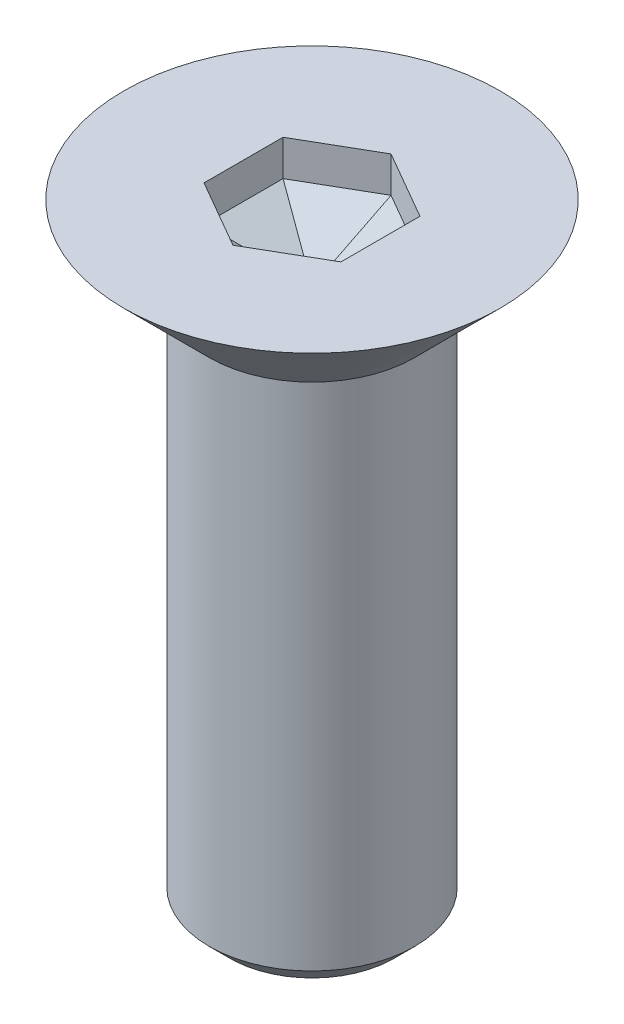
ISO-10303-21;
HEADER;
FILE_DESCRIPTION(('STEP AP214'),'2;1');
FILE_NAME('part.step','',(''),(''),'','','');
FILE_SCHEMA(('AUTOMOTIVE_DESIGN { 1 0 10303 214 1 1 1 1 }'));
ENDSEC;
DATA;
#1=APPLICATION_CONTEXT('core data for automotive mechanical design processes');
#2=APPLICATION_PROTOCOL_DEFINITION('international standard','automotive_design',2000,#1);
#3=PRODUCT_CONTEXT('',#1,'mechanical');
#4=PRODUCT('Part','Part','',(#3));
#5=PRODUCT_RELATED_PRODUCT_CATEGORY('part','',(#4));
#6=PRODUCT_DEFINITION_FORMATION('','',#4);
#7=PRODUCT_DEFINITION_CONTEXT('part definition',#1,'design');
#8=PRODUCT_DEFINITION('design','',#6,#7);
#9=PRODUCT_DEFINITION_SHAPE('','',#8);
#10=(LENGTH_UNIT() NAMED_UNIT(*) SI_UNIT(.MILLI.,.METRE.));
#11=(NAMED_UNIT(*) PLANE_ANGLE_UNIT() SI_UNIT($,.RADIAN.));
#12=(NAMED_UNIT(*) SI_UNIT($,.STERADIAN.) SOLID_ANGLE_UNIT());
#13=UNCERTAINTY_MEASURE_WITH_UNIT(LENGTH_MEASURE(1.E-05),#10,'distance_accuracy_value','');
#14=(GEOMETRIC_REPRESENTATION_CONTEXT(3) GLOBAL_UNCERTAINTY_ASSIGNED_CONTEXT((#13)) GLOBAL_UNIT_ASSIGNED_CONTEXT((#10,
#11,#12)) REPRESENTATION_CONTEXT('',''));
#15=CARTESIAN_POINT('',(0.,0.,0.));
#16=DIRECTION('',(0.,0.,1.));
#17=DIRECTION('',(1.,0.,0.));
#18=AXIS2_PLACEMENT_3D('',#15,#16,#17);
#19=CARTESIAN_POINT('',(0.,-1.86,0.));
#20=DIRECTION('',(0.,1.,0.));
#21=DIRECTION('',(0.,0.,1.));
#22=AXIS2_PLACEMENT_3D('',#19,#20,#21);
#23=CONICAL_SURFACE('',#22,0.89000000000002,0.785398163397443);
#24=CARTESIAN_POINT('',(0.,0.,0.));
#25=DIRECTION('',(0.,-1.,0.));
#26=DIRECTION('',(0.,0.,-1.));
#27=AXIS2_PLACEMENT_3D('',#24,#25,#26);
#28=CIRCLE('',#27,2.75);
#29=CARTESIAN_POINT('',(0.,0.,-2.75));
#30=VERTEX_POINT('',#29);
#31=EDGE_CURVE('E172',#30,#30,#28,.T.);
#32=ORIENTED_EDGE('',*,*,#31,.T.);
#33=EDGE_LOOP('',(#32));
#34=FACE_BOUND('',#33,.T.);
#35=CARTESIAN_POINT('',(0.,-1.25000000000001,0.));
#36=DIRECTION('',(0.,1.,0.));
#37=DIRECTION('',(0.,0.,1.));
#38=AXIS2_PLACEMENT_3D('',#35,#36,#37);
#39=CIRCLE('',#38,1.5);
#40=CARTESIAN_POINT('',(0.,-1.25000000000001,1.5));
#41=VERTEX_POINT('',#40);
#42=EDGE_CURVE('E161',#41,#41,#39,.T.);
#43=ORIENTED_EDGE('',*,*,#42,.T.);
#44=EDGE_LOOP('',(#43));
#45=FACE_BOUND('',#44,.T.);
#46=ADVANCED_FACE('F45',(#34,#45),#23,.T.);
#47=CARTESIAN_POINT('',(0.,0.,0.));
#48=DIRECTION('',(0.,1.,0.));
#49=DIRECTION('',(0.,0.,1.));
#50=AXIS2_PLACEMENT_3D('',#47,#48,#49);
#51=PLANE('',#50);
#52=DIRECTION('',(0.,0.,-1.));
#53=VECTOR('',#52,1.);
#54=CARTESIAN_POINT('',(1.,0.,0.577350269189626));
#55=LINE('',#54,#53);
#56=CARTESIAN_POINT('',(1.,0.,0.577350269189626));
#57=VERTEX_POINT('',#56);
#58=CARTESIAN_POINT('',(1.,0.,-0.577350269189626));
#59=VERTEX_POINT('',#58);
#60=EDGE_CURVE('E137',#57,#59,#55,.T.);
#61=ORIENTED_EDGE('',*,*,#60,.F.);
#62=DIRECTION('',(0.866025403784439,0.,-0.5));
#63=VECTOR('',#62,1.);
#64=CARTESIAN_POINT('',(0.,0.,1.15470053837925));
#65=LINE('',#64,#63);
#66=CARTESIAN_POINT('',(0.,0.,1.15470053837925));
#67=VERTEX_POINT('',#66);
#68=EDGE_CURVE('E154',#67,#57,#65,.T.);
#69=ORIENTED_EDGE('',*,*,#68,.F.);
#70=DIRECTION('',(0.866025403784439,0.,0.5));
#71=VECTOR('',#70,1.);
#72=CARTESIAN_POINT('',(-1.,0.,0.577350269189626));
#73=LINE('',#72,#71);
#74=CARTESIAN_POINT('',(-1.,0.,0.577350269189626));
#75=VERTEX_POINT('',#74);
#76=EDGE_CURVE('E147',#75,#67,#73,.T.);
#77=ORIENTED_EDGE('',*,*,#76,.F.);
#78=DIRECTION('',(0.,0.,1.));
#79=VECTOR('',#78,1.);
#80=CARTESIAN_POINT('',(-1.,0.,-0.577350269189626));
#81=LINE('',#80,#79);
#82=CARTESIAN_POINT('',(-1.,0.,-0.577350269189626));
#83=VERTEX_POINT('',#82);
#84=EDGE_CURVE('E143',#83,#75,#81,.T.);
#85=ORIENTED_EDGE('',*,*,#84,.F.);
#86=DIRECTION('',(-0.866025403784439,0.,0.5));
#87=VECTOR('',#86,1.);
#88=CARTESIAN_POINT('',(0.,0.,-1.15470053837925));
#89=LINE('',#88,#87);
#90=CARTESIAN_POINT('',(0.,0.,-1.15470053837925));
#91=VERTEX_POINT('',#90);
#92=EDGE_CURVE('E122',#91,#83,#89,.T.);
#93=ORIENTED_EDGE('',*,*,#92,.F.);
#94=DIRECTION('',(-0.866025403784438,0.,-0.5));
#95=VECTOR('',#94,1.);
#96=CARTESIAN_POINT('',(1.,0.,-0.577350269189626));
#97=LINE('',#96,#95);
#98=EDGE_CURVE('E131',#59,#91,#97,.T.);
#99=ORIENTED_EDGE('',*,*,#98,.F.);
#100=EDGE_LOOP('',(#61,#69,#77,#85,#93,#99));
#101=FACE_BOUND('',#100,.T.);
#102=ORIENTED_EDGE('',*,*,#31,.F.);
#103=EDGE_LOOP('',(#102));
#104=FACE_BOUND('',#103,.T.);
#105=ADVANCED_FACE('F139',(#101,#104),#51,.T.);
#106=CARTESIAN_POINT('',(0.,-9.,0.));
#107=DIRECTION('',(0.,1.,0.));
#108=DIRECTION('',(0.,0.,1.));
#109=AXIS2_PLACEMENT_3D('',#106,#107,#108);
#110=CYLINDRICAL_SURFACE('',#109,1.5);
#111=CARTESIAN_POINT('',(0.,-8.7,0.));
#112=DIRECTION('',(0.,-1.,0.));
#113=DIRECTION('',(0.,0.,-1.));
#114=AXIS2_PLACEMENT_3D('',#111,#112,#113);
#115=CIRCLE('',#114,1.5);
#116=CARTESIAN_POINT('',(0.,-8.7,-1.5));
#117=VERTEX_POINT('',#116);
#118=EDGE_CURVE('E11',#117,#117,#115,.F.);
#119=ORIENTED_EDGE('',*,*,#118,.T.);
#120=EDGE_LOOP('',(#119));
#121=FACE_BOUND('',#120,.T.);
#122=ORIENTED_EDGE('',*,*,#42,.F.);
#123=EDGE_LOOP('',(#122));
#124=FACE_BOUND('',#123,.T.);
#125=ADVANCED_FACE('F257',(#121,#124),#110,.T.);
#126=CARTESIAN_POINT('',(0.,-9.,0.));
#127=DIRECTION('',(0.,-1.,0.));
#128=DIRECTION('',(0.,0.,-1.));
#129=AXIS2_PLACEMENT_3D('',#126,#127,#128);
#130=PLANE('',#129);
#131=CARTESIAN_POINT('',(0.,-9.,0.));
#132=DIRECTION('',(0.,-1.,0.));
#133=DIRECTION('',(0.,0.,-1.));
#134=AXIS2_PLACEMENT_3D('',#131,#132,#133);
#135=CIRCLE('',#134,1.2);
#136=CARTESIAN_POINT('',(0.,-9.,-1.2));
#137=VERTEX_POINT('',#136);
#138=EDGE_CURVE('E54',#137,#137,#135,.T.);
#139=ORIENTED_EDGE('',*,*,#138,.T.);
#140=EDGE_LOOP('',(#139));
#141=FACE_BOUND('',#140,.T.);
#142=ADVANCED_FACE('F239',(#141),#130,.T.);
#143=CARTESIAN_POINT('',(1.,-1.1,0.577350269189626));
#144=DIRECTION('',(1.,0.,0.));
#145=DIRECTION('',(0.,0.,-1.));
#146=AXIS2_PLACEMENT_3D('',#143,#144,#145);
#147=PLANE('',#146);
#148=DIRECTION('',(0.,1.,0.));
#149=VECTOR('',#148,1.);
#150=CARTESIAN_POINT('',(1.,-1.1,-0.577350269189626));
#151=LINE('',#150,#149);
#152=CARTESIAN_POINT('',(1.,-0.523631123919309,-0.577350269189626));
#153=VERTEX_POINT('',#152);
#154=EDGE_CURVE('E128',#153,#59,#151,.T.);
#155=ORIENTED_EDGE('',*,*,#154,.F.);
#156=DIRECTION('',(0.,0.,1.));
#157=VECTOR('',#156,1.);
#158=CARTESIAN_POINT('',(1.,-0.523631123919309,0.577350269189626));
#159=LINE('',#158,#157);
#160=CARTESIAN_POINT('',(1.,-0.523631123919309,0.577350269189626));
#161=VERTEX_POINT('',#160);
#162=EDGE_CURVE('E68',#153,#161,#159,.T.);
#163=ORIENTED_EDGE('',*,*,#162,.T.);
#164=DIRECTION('',(0.,1.,0.));
#165=VECTOR('',#164,1.);
#166=CARTESIAN_POINT('',(1.,-1.1,0.577350269189626));
#167=LINE('',#166,#165);
#168=EDGE_CURVE('E158',#161,#57,#167,.T.);
#169=ORIENTED_EDGE('',*,*,#168,.T.);
#170=ORIENTED_EDGE('',*,*,#60,.T.);
#171=EDGE_LOOP('',(#155,#163,#169,#170));
#172=FACE_BOUND('',#171,.T.);
#173=ADVANCED_FACE('F311',(#172),#147,.F.);
#174=CARTESIAN_POINT('',(0.,-1.1,1.15470053837925));
#175=DIRECTION('',(0.5,0.,0.866025403784439));
#176=DIRECTION('',(0.866025403784439,0.,-0.5));
#177=AXIS2_PLACEMENT_3D('',#174,#175,#176);
#178=PLANE('',#177);
#179=ORIENTED_EDGE('',*,*,#168,.F.);
#180=DIRECTION('',(-0.866025403784439,0.,0.5));
#181=VECTOR('',#180,1.);
#182=CARTESIAN_POINT('',(0.,-0.523631123919309,1.15470053837925));
#183=LINE('',#182,#181);
#184=CARTESIAN_POINT('',(0.,-0.523631123919309,1.15470053837925));
#185=VERTEX_POINT('',#184);
#186=EDGE_CURVE('E207',#161,#185,#183,.T.);
#187=ORIENTED_EDGE('',*,*,#186,.T.);
#188=DIRECTION('',(0.,1.,0.));
#189=VECTOR('',#188,1.);
#190=CARTESIAN_POINT('',(0.,-1.1,1.15470053837925));
#191=LINE('',#190,#189);
#192=EDGE_CURVE('E162',#185,#67,#191,.T.);
#193=ORIENTED_EDGE('',*,*,#192,.T.);
#194=ORIENTED_EDGE('',*,*,#68,.T.);
#195=EDGE_LOOP('',(#179,#187,#193,#194));
#196=FACE_BOUND('',#195,.T.);
#197=ADVANCED_FACE('F296',(#196),#178,.F.);
#198=CARTESIAN_POINT('',(-1.,-1.1,0.577350269189626));
#199=DIRECTION('',(-0.5,0.,0.866025403784438));
#200=DIRECTION('',(0.866025403784439,0.,0.5));
#201=AXIS2_PLACEMENT_3D('',#198,#199,#200);
#202=PLANE('',#201);
#203=ORIENTED_EDGE('',*,*,#192,.F.);
#204=DIRECTION('',(-0.866025403784439,0.,-0.5));
#205=VECTOR('',#204,1.);
#206=CARTESIAN_POINT('',(-1.,-0.523631123919309,0.577350269189626));
#207=LINE('',#206,#205);
#208=CARTESIAN_POINT('',(-1.,-0.523631123919309,0.577350269189626));
#209=VERTEX_POINT('',#208);
#210=EDGE_CURVE('E198',#185,#209,#207,.T.);
#211=ORIENTED_EDGE('',*,*,#210,.T.);
#212=DIRECTION('',(0.,1.,0.));
#213=VECTOR('',#212,1.);
#214=CARTESIAN_POINT('',(-1.,-1.1,0.577350269189626));
#215=LINE('',#214,#213);
#216=EDGE_CURVE('E165',#209,#75,#215,.T.);
#217=ORIENTED_EDGE('',*,*,#216,.T.);
#218=ORIENTED_EDGE('',*,*,#76,.T.);
#219=EDGE_LOOP('',(#203,#211,#217,#218));
#220=FACE_BOUND('',#219,.T.);
#221=ADVANCED_FACE('F299',(#220),#202,.F.);
#222=CARTESIAN_POINT('',(-1.,-1.1,-0.577350269189626));
#223=DIRECTION('',(-1.,0.,0.));
#224=DIRECTION('',(0.,0.,1.));
#225=AXIS2_PLACEMENT_3D('',#222,#223,#224);
#226=PLANE('',#225);
#227=ORIENTED_EDGE('',*,*,#216,.F.);
#228=DIRECTION('',(0.,0.,-1.));
#229=VECTOR('',#228,1.);
#230=CARTESIAN_POINT('',(-1.,-0.523631123919309,-0.577350269189626));
#231=LINE('',#230,#229);
#232=CARTESIAN_POINT('',(-1.,-0.523631123919309,-0.577350269189626));
#233=VERTEX_POINT('',#232);
#234=EDGE_CURVE('E202',#209,#233,#231,.T.);
#235=ORIENTED_EDGE('',*,*,#234,.T.);
#236=DIRECTION('',(0.,1.,0.));
#237=VECTOR('',#236,1.);
#238=CARTESIAN_POINT('',(-1.,-1.1,-0.577350269189626));
#239=LINE('',#238,#237);
#240=EDGE_CURVE('E127',#233,#83,#239,.T.);
#241=ORIENTED_EDGE('',*,*,#240,.T.);
#242=ORIENTED_EDGE('',*,*,#84,.T.);
#243=EDGE_LOOP('',(#227,#235,#241,#242));
#244=FACE_BOUND('',#243,.T.);
#245=ADVANCED_FACE('F308',(#244),#226,.F.);
#246=CARTESIAN_POINT('',(0.,-1.1,-1.15470053837925));
#247=DIRECTION('',(-0.5,0.,-0.866025403784439));
#248=DIRECTION('',(-0.866025403784439,0.,0.5));
#249=AXIS2_PLACEMENT_3D('',#246,#247,#248);
#250=PLANE('',#249);
#251=ORIENTED_EDGE('',*,*,#240,.F.);
#252=DIRECTION('',(0.866025403784439,0.,-0.5));
#253=VECTOR('',#252,1.);
#254=CARTESIAN_POINT('',(0.,-0.523631123919309,-1.15470053837925));
#255=LINE('',#254,#253);
#256=CARTESIAN_POINT('',(0.,-0.523631123919309,-1.15470053837925));
#257=VERTEX_POINT('',#256);
#258=EDGE_CURVE('E125',#233,#257,#255,.T.);
#259=ORIENTED_EDGE('',*,*,#258,.T.);
#260=DIRECTION('',(0.,1.,0.));
#261=VECTOR('',#260,1.);
#262=CARTESIAN_POINT('',(0.,-1.1,-1.15470053837925));
#263=LINE('',#262,#261);
#264=EDGE_CURVE('E117',#257,#91,#263,.T.);
#265=ORIENTED_EDGE('',*,*,#264,.T.);
#266=ORIENTED_EDGE('',*,*,#92,.T.);
#267=EDGE_LOOP('',(#251,#259,#265,#266));
#268=FACE_BOUND('',#267,.T.);
#269=ADVANCED_FACE('F120',(#268),#250,.F.);
#270=CARTESIAN_POINT('',(1.,-1.1,-0.577350269189626));
#271=DIRECTION('',(0.5,0.,-0.866025403784439));
#272=DIRECTION('',(-0.866025403784439,0.,-0.5));
#273=AXIS2_PLACEMENT_3D('',#270,#271,#272);
#274=PLANE('',#273);
#275=ORIENTED_EDGE('',*,*,#264,.F.);
#276=DIRECTION('',(0.866025403784439,0.,0.5));
#277=VECTOR('',#276,1.);
#278=CARTESIAN_POINT('',(1.,-0.523631123919309,-0.577350269189626));
#279=LINE('',#278,#277);
#280=EDGE_CURVE('E61',#257,#153,#279,.T.);
#281=ORIENTED_EDGE('',*,*,#280,.T.);
#282=ORIENTED_EDGE('',*,*,#154,.T.);
#283=ORIENTED_EDGE('',*,*,#98,.T.);
#284=EDGE_LOOP('',(#275,#281,#282,#283));
#285=FACE_BOUND('',#284,.T.);
#286=ADVANCED_FACE('F132',(#285),#274,.F.);
#287=CARTESIAN_POINT('',(0.,-1.1,0.));
#288=DIRECTION('',(0.,1.,0.));
#289=DIRECTION('',(0.,0.,1.));
#290=AXIS2_PLACEMENT_3D('',#287,#288,#289);
#291=PLANE('',#290);
#292=DIRECTION('',(0.,0.,1.));
#293=VECTOR('',#292,1.);
#294=CARTESIAN_POINT('',(-0.00169982272685992,-1.1,0.));
#295=LINE('',#294,#293);
#296=CARTESIAN_POINT('',(-0.00169982272685992,-1.1,-0.000981393108927781));
#297=VERTEX_POINT('',#296);
#298=CARTESIAN_POINT('',(-0.00169982272685992,-1.1,0.000981393108927455));
#299=VERTEX_POINT('',#298);
#300=EDGE_CURVE('E191',#297,#299,#295,.T.);
#301=ORIENTED_EDGE('',*,*,#300,.T.);
#302=DIRECTION('',(0.866025403784439,0.,0.5));
#303=VECTOR('',#302,1.);
#304=CARTESIAN_POINT('',(-0.000849911363430068,-1.1,0.00147208966339101));
#305=LINE('',#304,#303);
#306=CARTESIAN_POINT('',(0.,-1.1,0.00196278621785466));
#307=VERTEX_POINT('',#306);
#308=EDGE_CURVE('E194',#299,#307,#305,.T.);
#309=ORIENTED_EDGE('',*,*,#308,.T.);
#310=DIRECTION('',(0.866025403784439,0.,-0.5));
#311=VECTOR('',#310,1.);
#312=CARTESIAN_POINT('',(0.000849911363430067,-1.1,0.00147208966339101));
#313=LINE('',#312,#311);
#314=CARTESIAN_POINT('',(0.00169982272685938,-1.1,0.00098139310892778));
#315=VERTEX_POINT('',#314);
#316=EDGE_CURVE('E185',#307,#315,#313,.T.);
#317=ORIENTED_EDGE('',*,*,#316,.T.);
#318=DIRECTION('',(0.,0.,-1.));
#319=VECTOR('',#318,1.);
#320=CARTESIAN_POINT('',(0.00169982272685938,-1.1,0.));
#321=LINE('',#320,#319);
#322=CARTESIAN_POINT('',(0.00169982272685938,-1.1,-0.000981393108926813));
#323=VERTEX_POINT('',#322);
#324=EDGE_CURVE('E182',#315,#323,#321,.T.);
#325=ORIENTED_EDGE('',*,*,#324,.T.);
#326=DIRECTION('',(-0.866025403784439,0.,-0.5));
#327=VECTOR('',#326,1.);
#328=CARTESIAN_POINT('',(0.000849911363429661,-1.1,-0.00147208966339031));
#329=LINE('',#328,#327);
#330=CARTESIAN_POINT('',(0.,-1.1,-0.00196278621785438));
#331=VERTEX_POINT('',#330);
#332=EDGE_CURVE('E176',#323,#331,#329,.T.);
#333=ORIENTED_EDGE('',*,*,#332,.T.);
#334=DIRECTION('',(-0.866025403784439,0.,0.5));
#335=VECTOR('',#334,1.);
#336=CARTESIAN_POINT('',(-0.000849911363430202,-1.1,-0.00147208966339125));
#337=LINE('',#336,#335);
#338=EDGE_CURVE('E188',#331,#297,#337,.T.);
#339=ORIENTED_EDGE('',*,*,#338,.T.);
#340=EDGE_LOOP('',(#301,#309,#317,#325,#333,#339));
#341=FACE_BOUND('',#340,.T.);
#342=ADVANCED_FACE('F279',(#341),#291,.T.);
#343=CARTESIAN_POINT('',(0.000849911363429661,-1.1,-0.00147208966339031));
#344=DIRECTION('',(0.249999999999998,-0.866025403784441,-0.433012701892215));
#345=DIRECTION('',(-0.866025403784439,0.,-0.5));
#346=AXIS2_PLACEMENT_3D('',#343,#344,#345);
#347=PLANE('',#346);
#348=DIRECTION('',(0.774596669241485,0.447213595499953,-0.447213595499959));
#349=VECTOR('',#348,1.);
#350=CARTESIAN_POINT('',(0.00135985818148752,-1.10019627862179,-0.000785114487141473));
#351=LINE('',#350,#349);
#352=EDGE_CURVE('E228',#153,#323,#351,.F.);
#353=ORIENTED_EDGE('',*,*,#352,.F.);
#354=ORIENTED_EDGE('',*,*,#280,.F.);
#355=DIRECTION('',(0.,-0.447213595499953,0.894427190999918));
#356=VECTOR('',#355,1.);
#357=CARTESIAN_POINT('',(0.,-1.10019627862179,-0.00157022897428383));
#358=LINE('',#357,#356);
#359=EDGE_CURVE('E232',#331,#257,#358,.F.);
#360=ORIENTED_EDGE('',*,*,#359,.F.);
#361=ORIENTED_EDGE('',*,*,#332,.F.);
#362=EDGE_LOOP('',(#353,#354,#360,#361));
#363=FACE_BOUND('',#362,.T.);
#364=ADVANCED_FACE('F276',(#363),#347,.F.);
#365=CARTESIAN_POINT('',(-0.000849911363430175,-1.1,-0.0014720896633912));
#366=DIRECTION('',(-0.249999999999998,-0.866025403784441,-0.433012701892215));
#367=DIRECTION('',(-0.866025403784439,0.,0.5));
#368=AXIS2_PLACEMENT_3D('',#365,#366,#367);
#369=PLANE('',#368);
#370=ORIENTED_EDGE('',*,*,#359,.T.);
#371=ORIENTED_EDGE('',*,*,#258,.F.);
#372=DIRECTION('',(0.774596669241485,-0.447213595499953,0.447213595499959));
#373=VECTOR('',#372,1.);
#374=CARTESIAN_POINT('',(-0.00135985818148776,-1.10019627862179,-0.000785114487142174));
#375=LINE('',#374,#373);
#376=EDGE_CURVE('E224',#297,#233,#375,.F.);
#377=ORIENTED_EDGE('',*,*,#376,.F.);
#378=ORIENTED_EDGE('',*,*,#338,.F.);
#379=EDGE_LOOP('',(#370,#371,#377,#378));
#380=FACE_BOUND('',#379,.T.);
#381=ADVANCED_FACE('F273',(#380),#369,.F.);
#382=CARTESIAN_POINT('',(0.00169982272685938,-1.1,0.));
#383=DIRECTION('',(0.499999999999995,-0.866025403784441,0.));
#384=DIRECTION('',(0.,0.,-1.));
#385=AXIS2_PLACEMENT_3D('',#382,#383,#384);
#386=PLANE('',#385);
#387=ORIENTED_EDGE('',*,*,#352,.T.);
#388=ORIENTED_EDGE('',*,*,#324,.F.);
#389=DIRECTION('',(0.774596669241485,0.447213595499953,0.447213595499959));
#390=VECTOR('',#389,1.);
#391=CARTESIAN_POINT('',(0.00135985818148764,-1.10019627862179,0.000785114487142418));
#392=LINE('',#391,#390);
#393=EDGE_CURVE('E220',#161,#315,#392,.F.);
#394=ORIENTED_EDGE('',*,*,#393,.F.);
#395=ORIENTED_EDGE('',*,*,#162,.F.);
#396=EDGE_LOOP('',(#387,#388,#394,#395));
#397=FACE_BOUND('',#396,.T.);
#398=ADVANCED_FACE('F269',(#397),#386,.F.);
#399=CARTESIAN_POINT('',(-0.00169982272685992,-1.1,0.));
#400=DIRECTION('',(-0.499999999999995,-0.866025403784441,0.));
#401=DIRECTION('',(0.,0.,1.));
#402=AXIS2_PLACEMENT_3D('',#399,#400,#401);
#403=PLANE('',#402);
#404=ORIENTED_EDGE('',*,*,#376,.T.);
#405=ORIENTED_EDGE('',*,*,#234,.F.);
#406=DIRECTION('',(0.774596669241486,-0.447213595499954,-0.447213595499959));
#407=VECTOR('',#406,1.);
#408=CARTESIAN_POINT('',(-0.00135985818148798,-1.10019627862179,0.000785114487142048));
#409=LINE('',#408,#407);
#410=EDGE_CURVE('E217',#299,#209,#409,.F.);
#411=ORIENTED_EDGE('',*,*,#410,.F.);
#412=ORIENTED_EDGE('',*,*,#300,.F.);
#413=EDGE_LOOP('',(#404,#405,#411,#412));
#414=FACE_BOUND('',#413,.T.);
#415=ADVANCED_FACE('F265',(#414),#403,.F.);
#416=CARTESIAN_POINT('',(0.00084991136343004,-1.1,0.00147208966339097));
#417=DIRECTION('',(0.249999999999998,-0.866025403784441,0.433012701892215));
#418=DIRECTION('',(0.866025403784439,0.,-0.5));
#419=AXIS2_PLACEMENT_3D('',#416,#417,#418);
#420=PLANE('',#419);
#421=ORIENTED_EDGE('',*,*,#393,.T.);
#422=ORIENTED_EDGE('',*,*,#316,.F.);
#423=DIRECTION('',(0.,0.447213595499954,0.894427190999918));
#424=VECTOR('',#423,1.);
#425=CARTESIAN_POINT('',(0.,-1.10019627862179,0.00157022897428374));
#426=LINE('',#425,#424);
#427=EDGE_CURVE('E214',#185,#307,#426,.F.);
#428=ORIENTED_EDGE('',*,*,#427,.F.);
#429=ORIENTED_EDGE('',*,*,#186,.F.);
#430=EDGE_LOOP('',(#421,#422,#428,#429));
#431=FACE_BOUND('',#430,.T.);
#432=ADVANCED_FACE('F247',(#431),#420,.F.);
#433=CARTESIAN_POINT('',(-0.000849911363430068,-1.1,0.00147208966339101));
#434=DIRECTION('',(-0.249999999999998,-0.866025403784441,0.433012701892215));
#435=DIRECTION('',(0.866025403784439,0.,0.5));
#436=AXIS2_PLACEMENT_3D('',#433,#434,#435);
#437=PLANE('',#436);
#438=ORIENTED_EDGE('',*,*,#410,.T.);
#439=ORIENTED_EDGE('',*,*,#210,.F.);
#440=ORIENTED_EDGE('',*,*,#427,.T.);
#441=ORIENTED_EDGE('',*,*,#308,.F.);
#442=EDGE_LOOP('',(#438,#439,#440,#441));
#443=FACE_BOUND('',#442,.T.);
#444=ADVANCED_FACE('F242',(#443),#437,.F.);
#445=CARTESIAN_POINT('',(0.,-9.,0.));
#446=DIRECTION('',(0.,1.,0.));
#447=DIRECTION('',(0.,0.,1.));
#448=AXIS2_PLACEMENT_3D('',#445,#446,#447);
#449=CONICAL_SURFACE('',#448,1.2,0.785398163397447);
#450=ORIENTED_EDGE('',*,*,#118,.F.);
#451=EDGE_LOOP('',(#450));
#452=FACE_BOUND('',#451,.T.);
#453=ORIENTED_EDGE('',*,*,#138,.F.);
#454=EDGE_LOOP('',(#453));
#455=FACE_BOUND('',#454,.T.);
#456=ADVANCED_FACE('F47',(#452,#455),#449,.T.);
#457=CLOSED_SHELL('',(#46,#105,#125,#142,#173,#197,#221,#245,#269,#286,#342,#364,#381,#398,#415,
#432,#444,#456));
#458=MANIFOLD_SOLID_BREP('B2',#457);
#459=ADVANCED_BREP_SHAPE_REPRESENTATION('',(#18,#458),#14);
#460=SHAPE_DEFINITION_REPRESENTATION(#9,#459);
ENDSEC;
END-ISO-10303-21;
